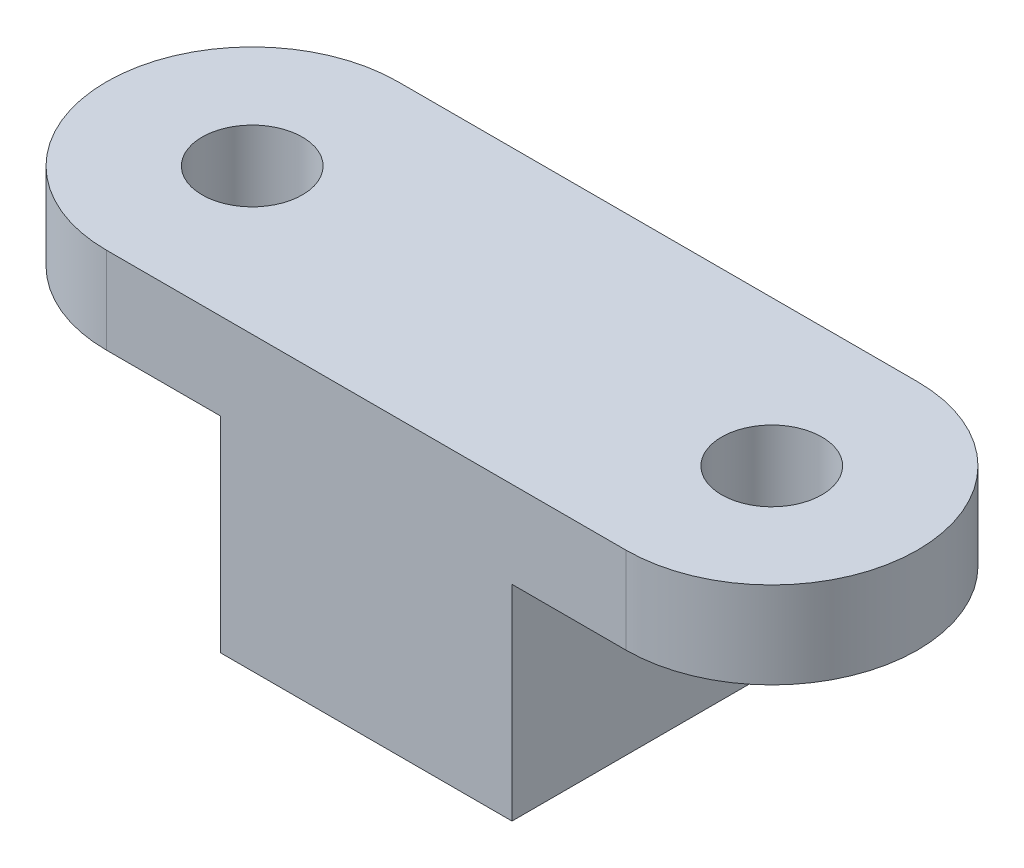
ISO-10303-21;
HEADER;
FILE_DESCRIPTION(('STEP AP214'),'2;1');
FILE_NAME('part.step','',(''),(''),'','','');
FILE_SCHEMA(('AUTOMOTIVE_DESIGN { 1 0 10303 214 1 1 1 1 }'));
ENDSEC;
DATA;
#1=APPLICATION_CONTEXT('core data for automotive mechanical design processes');
#2=APPLICATION_PROTOCOL_DEFINITION('international standard','automotive_design',2000,#1);
#3=PRODUCT_CONTEXT('',#1,'mechanical');
#4=PRODUCT('Part','Part','',(#3));
#5=PRODUCT_RELATED_PRODUCT_CATEGORY('part','',(#4));
#6=PRODUCT_DEFINITION_FORMATION('','',#4);
#7=PRODUCT_DEFINITION_CONTEXT('part definition',#1,'design');
#8=PRODUCT_DEFINITION('design','',#6,#7);
#9=PRODUCT_DEFINITION_SHAPE('','',#8);
#10=(LENGTH_UNIT() NAMED_UNIT(*) SI_UNIT(.MILLI.,.METRE.));
#11=(NAMED_UNIT(*) PLANE_ANGLE_UNIT() SI_UNIT($,.RADIAN.));
#12=(NAMED_UNIT(*) SI_UNIT($,.STERADIAN.) SOLID_ANGLE_UNIT());
#13=UNCERTAINTY_MEASURE_WITH_UNIT(LENGTH_MEASURE(1.E-05),#10,'distance_accuracy_value','');
#14=(GEOMETRIC_REPRESENTATION_CONTEXT(3) GLOBAL_UNCERTAINTY_ASSIGNED_CONTEXT((#13)) GLOBAL_UNIT_ASSIGNED_CONTEXT((#10,
#11,#12)) REPRESENTATION_CONTEXT('',''));
#15=CARTESIAN_POINT('',(0.,0.,0.));
#16=DIRECTION('',(0.,0.,1.));
#17=DIRECTION('',(1.,0.,0.));
#18=AXIS2_PLACEMENT_3D('',#15,#16,#17);
#19=CARTESIAN_POINT('',(0.,19.,-32.));
#20=DIRECTION('',(0.,0.,1.));
#21=DIRECTION('',(1.,0.,0.));
#22=AXIS2_PLACEMENT_3D('',#19,#20,#21);
#23=PLANE('',#22);
#24=DIRECTION('',(0.,1.,0.));
#25=VECTOR('',#24,1.);
#26=CARTESIAN_POINT('',(76.,6.,-32.));
#27=LINE('',#26,#25);
#28=CARTESIAN_POINT('',(76.,-45.,-32.));
#29=VERTEX_POINT('',#28);
#30=CARTESIAN_POINT('',(76.,6.,-32.));
#31=VERTEX_POINT('',#30);
#32=EDGE_CURVE('E130',#29,#31,#27,.T.);
#33=ORIENTED_EDGE('',*,*,#32,.T.);
#34=DIRECTION('',(1.,0.,0.));
#35=VECTOR('',#34,1.);
#36=CARTESIAN_POINT('',(38.,6.,-32.));
#37=LINE('',#36,#35);
#38=CARTESIAN_POINT('',(38.,6.,-32.));
#39=VERTEX_POINT('',#38);
#40=EDGE_CURVE('E177',#39,#31,#37,.T.);
#41=ORIENTED_EDGE('',*,*,#40,.F.);
#42=DIRECTION('',(0.,1.,0.));
#43=VECTOR('',#42,1.);
#44=CARTESIAN_POINT('',(38.,6.,-32.));
#45=LINE('',#44,#43);
#46=CARTESIAN_POINT('',(38.,-45.,-32.));
#47=VERTEX_POINT('',#46);
#48=EDGE_CURVE('E169',#47,#39,#45,.T.);
#49=ORIENTED_EDGE('',*,*,#48,.F.);
#50=DIRECTION('',(1.,0.,0.));
#51=VECTOR('',#50,1.);
#52=CARTESIAN_POINT('',(57.,-45.,-32.));
#53=LINE('',#52,#51);
#54=CARTESIAN_POINT('',(25.,-45.,-32.));
#55=VERTEX_POINT('',#54);
#56=EDGE_CURVE('E189',#55,#47,#53,.T.);
#57=ORIENTED_EDGE('',*,*,#56,.F.);
#58=DIRECTION('',(0.,1.,0.));
#59=VECTOR('',#58,1.);
#60=CARTESIAN_POINT('',(25.,-45.,-32.));
#61=LINE('',#60,#59);
#62=CARTESIAN_POINT('',(25.,0.,-32.));
#63=VERTEX_POINT('',#62);
#64=EDGE_CURVE('E193',#55,#63,#61,.T.);
#65=ORIENTED_EDGE('',*,*,#64,.T.);
#66=DIRECTION('',(-1.,0.,0.));
#67=VECTOR('',#66,1.);
#68=CARTESIAN_POINT('',(0.,0.,-32.));
#69=LINE('',#68,#67);
#70=CARTESIAN_POINT('',(0.,0.,-32.));
#71=VERTEX_POINT('',#70);
#72=EDGE_CURVE('E245',#63,#71,#69,.T.);
#73=ORIENTED_EDGE('',*,*,#72,.T.);
#74=DIRECTION('',(0.,-1.,0.));
#75=VECTOR('',#74,1.);
#76=CARTESIAN_POINT('',(0.,19.,-32.));
#77=LINE('',#76,#75);
#78=CARTESIAN_POINT('',(0.,19.,-32.));
#79=VERTEX_POINT('',#78);
#80=EDGE_CURVE('E234',#79,#71,#77,.T.);
#81=ORIENTED_EDGE('',*,*,#80,.F.);
#82=DIRECTION('',(-1.,0.,0.));
#83=VECTOR('',#82,1.);
#84=CARTESIAN_POINT('',(0.,19.,-32.));
#85=LINE('',#84,#83);
#86=CARTESIAN_POINT('',(114.,19.,-32.));
#87=VERTEX_POINT('',#86);
#88=EDGE_CURVE('E231',#87,#79,#85,.T.);
#89=ORIENTED_EDGE('',*,*,#88,.F.);
#90=DIRECTION('',(0.,-1.,0.));
#91=VECTOR('',#90,1.);
#92=CARTESIAN_POINT('',(114.,19.,-32.));
#93=LINE('',#92,#91);
#94=CARTESIAN_POINT('',(114.,0.,-32.));
#95=VERTEX_POINT('',#94);
#96=EDGE_CURVE('E251',#87,#95,#93,.T.);
#97=ORIENTED_EDGE('',*,*,#96,.T.);
#98=CARTESIAN_POINT('',(89.,0.,-32.));
#99=VERTEX_POINT('',#98);
#100=EDGE_CURVE('E225',#95,#99,#69,.T.);
#101=ORIENTED_EDGE('',*,*,#100,.T.);
#102=DIRECTION('',(0.,1.,0.));
#103=VECTOR('',#102,1.);
#104=CARTESIAN_POINT('',(89.,-45.,-32.));
#105=LINE('',#104,#103);
#106=CARTESIAN_POINT('',(89.,-45.,-32.));
#107=VERTEX_POINT('',#106);
#108=EDGE_CURVE('E152',#107,#99,#105,.T.);
#109=ORIENTED_EDGE('',*,*,#108,.F.);
#110=DIRECTION('',(-1.,0.,0.));
#111=VECTOR('',#110,1.);
#112=CARTESIAN_POINT('',(57.,-45.,-32.));
#113=LINE('',#112,#111);
#114=EDGE_CURVE('E145',#107,#29,#113,.T.);
#115=ORIENTED_EDGE('',*,*,#114,.T.);
#116=EDGE_LOOP('',(#33,#41,#49,#57,#65,#73,#81,#89,#97,#101,#109,#115));
#117=FACE_BOUND('',#116,.T.);
#118=ADVANCED_FACE('F45',(#117),#23,.F.);
#119=CARTESIAN_POINT('',(0.,-45.,0.));
#120=DIRECTION('',(0.,1.,0.));
#121=DIRECTION('',(0.,0.,1.));
#122=AXIS2_PLACEMENT_3D('',#119,#120,#121);
#123=PLANE('',#122);
#124=DIRECTION('',(1.,0.,0.));
#125=VECTOR('',#124,1.);
#126=CARTESIAN_POINT('',(38.,-45.,19.));
#127=LINE('',#126,#125);
#128=CARTESIAN_POINT('',(38.,-45.,19.));
#129=VERTEX_POINT('',#128);
#130=CARTESIAN_POINT('',(76.,-45.,19.));
#131=VERTEX_POINT('',#130);
#132=EDGE_CURVE('E148',#129,#131,#127,.T.);
#133=ORIENTED_EDGE('',*,*,#132,.T.);
#134=DIRECTION('',(0.,0.,-1.));
#135=VECTOR('',#134,1.);
#136=CARTESIAN_POINT('',(76.,-45.,-32.));
#137=LINE('',#136,#135);
#138=EDGE_CURVE('E133',#131,#29,#137,.T.);
#139=ORIENTED_EDGE('',*,*,#138,.T.);
#140=ORIENTED_EDGE('',*,*,#114,.F.);
#141=DIRECTION('',(0.,0.,-1.));
#142=VECTOR('',#141,1.);
#143=CARTESIAN_POINT('',(89.,-45.,-32.));
#144=LINE('',#143,#142);
#145=CARTESIAN_POINT('',(88.9999999999999,-45.,32.));
#146=VERTEX_POINT('',#145);
#147=EDGE_CURVE('E154',#146,#107,#144,.T.);
#148=ORIENTED_EDGE('',*,*,#147,.F.);
#149=DIRECTION('',(-1.,0.,0.));
#150=VECTOR('',#149,1.);
#151=CARTESIAN_POINT('',(25.,-45.,32.));
#152=LINE('',#151,#150);
#153=CARTESIAN_POINT('',(25.,-45.,32.));
#154=VERTEX_POINT('',#153);
#155=EDGE_CURVE('E182',#146,#154,#152,.T.);
#156=ORIENTED_EDGE('',*,*,#155,.T.);
#157=DIRECTION('',(0.,0.,-1.));
#158=VECTOR('',#157,1.);
#159=CARTESIAN_POINT('',(25.,-45.,-32.));
#160=LINE('',#159,#158);
#161=EDGE_CURVE('E186',#154,#55,#160,.T.);
#162=ORIENTED_EDGE('',*,*,#161,.T.);
#163=ORIENTED_EDGE('',*,*,#56,.T.);
#164=DIRECTION('',(0.,0.,-1.));
#165=VECTOR('',#164,1.);
#166=CARTESIAN_POINT('',(38.,-45.,-32.));
#167=LINE('',#166,#165);
#168=EDGE_CURVE('E174',#129,#47,#167,.T.);
#169=ORIENTED_EDGE('',*,*,#168,.F.);
#170=EDGE_LOOP('',(#133,#139,#140,#148,#156,#162,#163,#169));
#171=FACE_BOUND('',#170,.T.);
#172=ADVANCED_FACE('F143',(#171),#123,.F.);
#173=CARTESIAN_POINT('',(0.,0.,0.));
#174=DIRECTION('',(0.,1.,0.));
#175=DIRECTION('',(0.,0.,1.));
#176=AXIS2_PLACEMENT_3D('',#173,#174,#175);
#177=PLANE('',#176);
#178=CARTESIAN_POINT('',(114.,0.,0.));
#179=DIRECTION('',(0.,1.,0.));
#180=DIRECTION('',(0.,0.,1.));
#181=AXIS2_PLACEMENT_3D('',#178,#179,#180);
#182=CIRCLE('',#181,11.);
#183=CARTESIAN_POINT('',(114.,0.,11.));
#184=VERTEX_POINT('',#183);
#185=EDGE_CURVE('E203',#184,#184,#182,.T.);
#186=ORIENTED_EDGE('',*,*,#185,.T.);
#187=EDGE_LOOP('',(#186));
#188=FACE_BOUND('',#187,.T.);
#189=DIRECTION('',(1.,0.,0.));
#190=VECTOR('',#189,1.);
#191=CARTESIAN_POINT('',(0.,0.,32.));
#192=LINE('',#191,#190);
#193=CARTESIAN_POINT('',(88.9999999999999,0.,32.));
#194=VERTEX_POINT('',#193);
#195=CARTESIAN_POINT('',(114.,0.,32.));
#196=VERTEX_POINT('',#195);
#197=EDGE_CURVE('E238',#194,#196,#192,.T.);
#198=ORIENTED_EDGE('',*,*,#197,.F.);
#199=DIRECTION('',(0.,0.,-1.));
#200=VECTOR('',#199,1.);
#201=CARTESIAN_POINT('',(89.,0.,-32.));
#202=LINE('',#201,#200);
#203=EDGE_CURVE('E155',#194,#99,#202,.T.);
#204=ORIENTED_EDGE('',*,*,#203,.T.);
#205=ORIENTED_EDGE('',*,*,#100,.F.);
#206=CARTESIAN_POINT('',(114.,0.,0.));
#207=DIRECTION('',(0.,1.,0.));
#208=DIRECTION('',(0.,0.,1.));
#209=AXIS2_PLACEMENT_3D('',#206,#207,#208);
#210=CIRCLE('',#209,32.);
#211=EDGE_CURVE('E242',#196,#95,#210,.T.);
#212=ORIENTED_EDGE('',*,*,#211,.F.);
#213=EDGE_LOOP('',(#198,#204,#205,#212));
#214=FACE_BOUND('',#213,.T.);
#215=ADVANCED_FACE('F266',(#188,#214),#177,.F.);
#216=CARTESIAN_POINT('',(0.,0.,0.));
#217=DIRECTION('',(0.,1.,0.));
#218=DIRECTION('',(0.,0.,1.));
#219=AXIS2_PLACEMENT_3D('',#216,#217,#218);
#220=CIRCLE('',#219,11.);
#221=CARTESIAN_POINT('',(0.,0.,11.));
#222=VERTEX_POINT('',#221);
#223=EDGE_CURVE('E208',#222,#222,#220,.T.);
#224=ORIENTED_EDGE('',*,*,#223,.T.);
#225=EDGE_LOOP('',(#224));
#226=FACE_BOUND('',#225,.T.);
#227=DIRECTION('',(0.,0.,-1.));
#228=VECTOR('',#227,1.);
#229=CARTESIAN_POINT('',(25.,0.,-32.));
#230=LINE('',#229,#228);
#231=CARTESIAN_POINT('',(25.,0.,32.));
#232=VERTEX_POINT('',#231);
#233=EDGE_CURVE('E69',#232,#63,#230,.T.);
#234=ORIENTED_EDGE('',*,*,#233,.F.);
#235=CARTESIAN_POINT('',(0.,0.,32.));
#236=VERTEX_POINT('',#235);
#237=EDGE_CURVE('E239',#236,#232,#192,.T.);
#238=ORIENTED_EDGE('',*,*,#237,.F.);
#239=CARTESIAN_POINT('',(0.,0.,0.));
#240=DIRECTION('',(0.,1.,0.));
#241=DIRECTION('',(0.,0.,1.));
#242=AXIS2_PLACEMENT_3D('',#239,#240,#241);
#243=CIRCLE('',#242,32.);
#244=EDGE_CURVE('E216',#71,#236,#243,.T.);
#245=ORIENTED_EDGE('',*,*,#244,.F.);
#246=ORIENTED_EDGE('',*,*,#72,.F.);
#247=EDGE_LOOP('',(#234,#238,#245,#246));
#248=FACE_BOUND('',#247,.T.);
#249=ADVANCED_FACE('F279',(#226,#248),#177,.F.);
#250=CARTESIAN_POINT('',(0.,19.,0.));
#251=DIRECTION('',(0.,1.,0.));
#252=DIRECTION('',(0.,0.,1.));
#253=AXIS2_PLACEMENT_3D('',#250,#251,#252);
#254=PLANE('',#253);
#255=CARTESIAN_POINT('',(0.,19.,0.));
#256=DIRECTION('',(0.,1.,0.));
#257=DIRECTION('',(0.,0.,1.));
#258=AXIS2_PLACEMENT_3D('',#255,#256,#257);
#259=CIRCLE('',#258,11.);
#260=CARTESIAN_POINT('',(0.,19.,11.));
#261=VERTEX_POINT('',#260);
#262=EDGE_CURVE('E212',#261,#261,#259,.T.);
#263=ORIENTED_EDGE('',*,*,#262,.F.);
#264=EDGE_LOOP('',(#263));
#265=FACE_BOUND('',#264,.T.);
#266=CARTESIAN_POINT('',(0.,19.,0.));
#267=DIRECTION('',(0.,1.,0.));
#268=DIRECTION('',(0.,0.,1.));
#269=AXIS2_PLACEMENT_3D('',#266,#267,#268);
#270=CIRCLE('',#269,32.);
#271=CARTESIAN_POINT('',(0.,19.,32.));
#272=VERTEX_POINT('',#271);
#273=EDGE_CURVE('E220',#79,#272,#270,.T.);
#274=ORIENTED_EDGE('',*,*,#273,.T.);
#275=DIRECTION('',(1.,0.,0.));
#276=VECTOR('',#275,1.);
#277=CARTESIAN_POINT('',(0.,19.,32.));
#278=LINE('',#277,#276);
#279=CARTESIAN_POINT('',(114.,19.,32.));
#280=VERTEX_POINT('',#279);
#281=EDGE_CURVE('E224',#272,#280,#278,.T.);
#282=ORIENTED_EDGE('',*,*,#281,.T.);
#283=CARTESIAN_POINT('',(114.,19.,0.));
#284=DIRECTION('',(0.,1.,0.));
#285=DIRECTION('',(0.,0.,1.));
#286=AXIS2_PLACEMENT_3D('',#283,#284,#285);
#287=CIRCLE('',#286,32.);
#288=EDGE_CURVE('E228',#280,#87,#287,.T.);
#289=ORIENTED_EDGE('',*,*,#288,.T.);
#290=ORIENTED_EDGE('',*,*,#88,.T.);
#291=EDGE_LOOP('',(#274,#282,#289,#290));
#292=FACE_BOUND('',#291,.T.);
#293=CARTESIAN_POINT('',(114.,19.,0.));
#294=DIRECTION('',(0.,1.,0.));
#295=DIRECTION('',(0.,0.,1.));
#296=AXIS2_PLACEMENT_3D('',#293,#294,#295);
#297=CIRCLE('',#296,11.);
#298=CARTESIAN_POINT('',(114.,19.,11.));
#299=VERTEX_POINT('',#298);
#300=EDGE_CURVE('E204',#299,#299,#297,.T.);
#301=ORIENTED_EDGE('',*,*,#300,.F.);
#302=EDGE_LOOP('',(#301));
#303=FACE_BOUND('',#302,.T.);
#304=ADVANCED_FACE('F272',(#265,#292,#303),#254,.T.);
#305=CARTESIAN_POINT('',(0.,19.,0.));
#306=DIRECTION('',(0.,-1.,0.));
#307=DIRECTION('',(0.,0.,-1.));
#308=AXIS2_PLACEMENT_3D('',#305,#306,#307);
#309=CYLINDRICAL_SURFACE('',#308,32.);
#310=ORIENTED_EDGE('',*,*,#244,.T.);
#311=DIRECTION('',(0.,-1.,0.));
#312=VECTOR('',#311,1.);
#313=CARTESIAN_POINT('',(0.,19.,32.));
#314=LINE('',#313,#312);
#315=EDGE_CURVE('E11',#272,#236,#314,.T.);
#316=ORIENTED_EDGE('',*,*,#315,.F.);
#317=ORIENTED_EDGE('',*,*,#273,.F.);
#318=ORIENTED_EDGE('',*,*,#80,.T.);
#319=EDGE_LOOP('',(#310,#316,#317,#318));
#320=FACE_BOUND('',#319,.T.);
#321=ADVANCED_FACE('F47',(#320),#309,.T.);
#322=CARTESIAN_POINT('',(0.,19.,32.));
#323=DIRECTION('',(0.,0.,-1.));
#324=DIRECTION('',(-1.,0.,0.));
#325=AXIS2_PLACEMENT_3D('',#322,#323,#324);
#326=PLANE('',#325);
#327=DIRECTION('',(0.,1.,0.));
#328=VECTOR('',#327,1.);
#329=CARTESIAN_POINT('',(88.9999999999999,-45.,32.));
#330=LINE('',#329,#328);
#331=EDGE_CURVE('E159',#146,#194,#330,.T.);
#332=ORIENTED_EDGE('',*,*,#331,.T.);
#333=ORIENTED_EDGE('',*,*,#197,.T.);
#334=DIRECTION('',(0.,-1.,0.));
#335=VECTOR('',#334,1.);
#336=CARTESIAN_POINT('',(114.,19.,32.));
#337=LINE('',#336,#335);
#338=EDGE_CURVE('E54',#280,#196,#337,.T.);
#339=ORIENTED_EDGE('',*,*,#338,.F.);
#340=ORIENTED_EDGE('',*,*,#281,.F.);
#341=ORIENTED_EDGE('',*,*,#315,.T.);
#342=ORIENTED_EDGE('',*,*,#237,.T.);
#343=DIRECTION('',(0.,1.,0.));
#344=VECTOR('',#343,1.);
#345=CARTESIAN_POINT('',(25.,-45.,32.));
#346=LINE('',#345,#344);
#347=EDGE_CURVE('E199',#154,#232,#346,.T.);
#348=ORIENTED_EDGE('',*,*,#347,.F.);
#349=ORIENTED_EDGE('',*,*,#155,.F.);
#350=EDGE_LOOP('',(#332,#333,#339,#340,#341,#342,#348,#349));
#351=FACE_BOUND('',#350,.T.);
#352=ADVANCED_FACE('F275',(#351),#326,.F.);
#353=CARTESIAN_POINT('',(114.,19.,0.));
#354=DIRECTION('',(0.,-1.,0.));
#355=DIRECTION('',(0.,0.,-1.));
#356=AXIS2_PLACEMENT_3D('',#353,#354,#355);
#357=CYLINDRICAL_SURFACE('',#356,32.);
#358=ORIENTED_EDGE('',*,*,#211,.T.);
#359=ORIENTED_EDGE('',*,*,#96,.F.);
#360=ORIENTED_EDGE('',*,*,#288,.F.);
#361=ORIENTED_EDGE('',*,*,#338,.T.);
#362=EDGE_LOOP('',(#358,#359,#360,#361));
#363=FACE_BOUND('',#362,.T.);
#364=ADVANCED_FACE('F260',(#363),#357,.T.);
#365=CARTESIAN_POINT('',(0.,19.,0.));
#366=DIRECTION('',(0.,-1.,0.));
#367=DIRECTION('',(0.,0.,-1.));
#368=AXIS2_PLACEMENT_3D('',#365,#366,#367);
#369=CYLINDRICAL_SURFACE('',#368,11.);
#370=ORIENTED_EDGE('',*,*,#262,.T.);
#371=EDGE_LOOP('',(#370));
#372=FACE_BOUND('',#371,.T.);
#373=ORIENTED_EDGE('',*,*,#223,.F.);
#374=EDGE_LOOP('',(#373));
#375=FACE_BOUND('',#374,.T.);
#376=ADVANCED_FACE('F310',(#372,#375),#369,.F.);
#377=CARTESIAN_POINT('',(114.,19.,0.));
#378=DIRECTION('',(0.,-1.,0.));
#379=DIRECTION('',(0.,0.,-1.));
#380=AXIS2_PLACEMENT_3D('',#377,#378,#379);
#381=CYLINDRICAL_SURFACE('',#380,11.);
#382=ORIENTED_EDGE('',*,*,#300,.T.);
#383=EDGE_LOOP('',(#382));
#384=FACE_BOUND('',#383,.T.);
#385=ORIENTED_EDGE('',*,*,#185,.F.);
#386=EDGE_LOOP('',(#385));
#387=FACE_BOUND('',#386,.T.);
#388=ADVANCED_FACE('F328',(#384,#387),#381,.F.);
#389=CARTESIAN_POINT('',(25.,-45.,-32.));
#390=DIRECTION('',(1.,0.,0.));
#391=DIRECTION('',(0.,0.,-1.));
#392=AXIS2_PLACEMENT_3D('',#389,#390,#391);
#393=PLANE('',#392);
#394=ORIENTED_EDGE('',*,*,#233,.T.);
#395=ORIENTED_EDGE('',*,*,#64,.F.);
#396=ORIENTED_EDGE('',*,*,#161,.F.);
#397=ORIENTED_EDGE('',*,*,#347,.T.);
#398=EDGE_LOOP('',(#394,#395,#396,#397));
#399=FACE_BOUND('',#398,.T.);
#400=ADVANCED_FACE('F283',(#399),#393,.F.);
#401=CARTESIAN_POINT('',(38.,-45.,19.));
#402=DIRECTION('',(0.,0.707106781186548,0.707106781186547));
#403=DIRECTION('',(0.,-0.707106781186547,0.707106781186548));
#404=AXIS2_PLACEMENT_3D('',#401,#402,#403);
#405=PLANE('',#404);
#406=ORIENTED_EDGE('',*,*,#40,.T.);
#407=DIRECTION('',(0.,-0.707106781186548,0.707106781186548));
#408=VECTOR('',#407,1.);
#409=CARTESIAN_POINT('',(76.,-45.,19.));
#410=LINE('',#409,#408);
#411=EDGE_CURVE('E135',#31,#131,#410,.T.);
#412=ORIENTED_EDGE('',*,*,#411,.T.);
#413=ORIENTED_EDGE('',*,*,#132,.F.);
#414=DIRECTION('',(0.,-0.707106781186548,0.707106781186548));
#415=VECTOR('',#414,1.);
#416=CARTESIAN_POINT('',(38.,-45.,19.));
#417=LINE('',#416,#415);
#418=EDGE_CURVE('E61',#39,#129,#417,.T.);
#419=ORIENTED_EDGE('',*,*,#418,.F.);
#420=EDGE_LOOP('',(#406,#412,#413,#419));
#421=FACE_BOUND('',#420,.T.);
#422=ADVANCED_FACE('F298',(#421),#405,.F.);
#423=CARTESIAN_POINT('',(38.,0.,0.));
#424=DIRECTION('',(-1.,0.,0.));
#425=DIRECTION('',(0.,0.,1.));
#426=AXIS2_PLACEMENT_3D('',#423,#424,#425);
#427=PLANE('',#426);
#428=ORIENTED_EDGE('',*,*,#48,.T.);
#429=ORIENTED_EDGE('',*,*,#418,.T.);
#430=ORIENTED_EDGE('',*,*,#168,.T.);
#431=EDGE_LOOP('',(#428,#429,#430));
#432=FACE_BOUND('',#431,.T.);
#433=ADVANCED_FACE('F290',(#432),#427,.F.);
#434=CARTESIAN_POINT('',(89.,-45.,-32.));
#435=DIRECTION('',(1.,0.,0.));
#436=DIRECTION('',(0.,0.,-1.));
#437=AXIS2_PLACEMENT_3D('',#434,#435,#436);
#438=PLANE('',#437);
#439=ORIENTED_EDGE('',*,*,#203,.F.);
#440=ORIENTED_EDGE('',*,*,#331,.F.);
#441=ORIENTED_EDGE('',*,*,#147,.T.);
#442=ORIENTED_EDGE('',*,*,#108,.T.);
#443=EDGE_LOOP('',(#439,#440,#441,#442));
#444=FACE_BOUND('',#443,.T.);
#445=ADVANCED_FACE('F288',(#444),#438,.T.);
#446=CARTESIAN_POINT('',(76.,0.,0.));
#447=DIRECTION('',(1.,0.,0.));
#448=DIRECTION('',(0.,0.,1.));
#449=AXIS2_PLACEMENT_3D('',#446,#447,#448);
#450=PLANE('',#449);
#451=ORIENTED_EDGE('',*,*,#32,.F.);
#452=ORIENTED_EDGE('',*,*,#138,.F.);
#453=ORIENTED_EDGE('',*,*,#411,.F.);
#454=EDGE_LOOP('',(#451,#452,#453));
#455=FACE_BOUND('',#454,.T.);
#456=ADVANCED_FACE('F132',(#455),#450,.F.);
#457=CLOSED_SHELL('',(#118,#172,#215,#249,#304,#321,#352,#364,#376,#388,#400,#422,#433,#445,#456));
#458=MANIFOLD_SOLID_BREP('B2',#457);
#459=ADVANCED_BREP_SHAPE_REPRESENTATION('',(#18,#458),#14);
#460=SHAPE_DEFINITION_REPRESENTATION(#9,#459);
ENDSEC;
END-ISO-10303-21;
